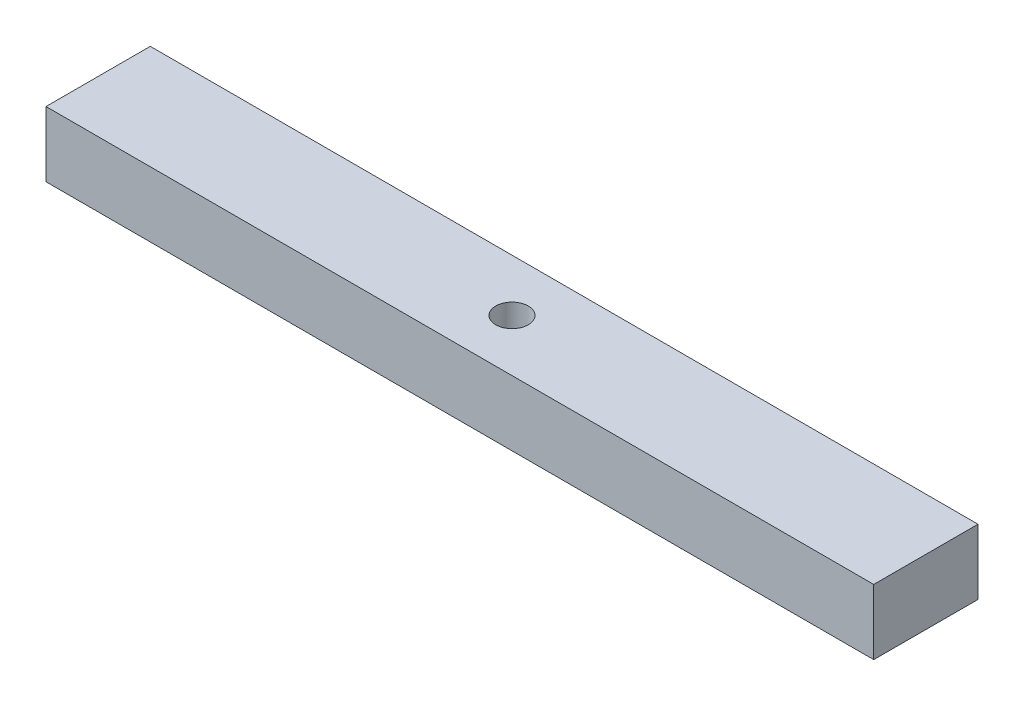
ISO-10303-21;
HEADER;
FILE_DESCRIPTION(('STEP AP214'),'2;1');
FILE_NAME('part.step','',(''),(''),'','','');
FILE_SCHEMA(('AUTOMOTIVE_DESIGN { 1 0 10303 214 1 1 1 1 }'));
ENDSEC;
DATA;
#1=APPLICATION_CONTEXT('core data for automotive mechanical design processes');
#2=APPLICATION_PROTOCOL_DEFINITION('international standard','automotive_design',2000,#1);
#3=PRODUCT_CONTEXT('',#1,'mechanical');
#4=PRODUCT('Part','Part','',(#3));
#5=PRODUCT_RELATED_PRODUCT_CATEGORY('part','',(#4));
#6=PRODUCT_DEFINITION_FORMATION('','',#4);
#7=PRODUCT_DEFINITION_CONTEXT('part definition',#1,'design');
#8=PRODUCT_DEFINITION('design','',#6,#7);
#9=PRODUCT_DEFINITION_SHAPE('','',#8);
#10=(LENGTH_UNIT() NAMED_UNIT(*) SI_UNIT(.MILLI.,.METRE.));
#11=(NAMED_UNIT(*) PLANE_ANGLE_UNIT() SI_UNIT($,.RADIAN.));
#12=(NAMED_UNIT(*) SI_UNIT($,.STERADIAN.) SOLID_ANGLE_UNIT());
#13=UNCERTAINTY_MEASURE_WITH_UNIT(LENGTH_MEASURE(1.E-05),#10,'distance_accuracy_value','');
#14=(GEOMETRIC_REPRESENTATION_CONTEXT(3) GLOBAL_UNCERTAINTY_ASSIGNED_CONTEXT((#13)) GLOBAL_UNIT_ASSIGNED_CONTEXT((#10,
#11,#12)) REPRESENTATION_CONTEXT('',''));
#15=CARTESIAN_POINT('',(0.,0.,0.));
#16=DIRECTION('',(0.,0.,1.));
#17=DIRECTION('',(1.,0.,0.));
#18=AXIS2_PLACEMENT_3D('',#15,#16,#17);
#19=CARTESIAN_POINT('',(0.,10.,0.));
#20=DIRECTION('',(0.,1.,0.));
#21=DIRECTION('',(0.,0.,1.));
#22=AXIS2_PLACEMENT_3D('',#19,#20,#21);
#23=PLANE('',#22);
#24=DIRECTION('',(0.,0.,1.));
#25=VECTOR('',#24,1.);
#26=CARTESIAN_POINT('',(-63.5,10.,8.));
#27=LINE('',#26,#25);
#28=CARTESIAN_POINT('',(-63.5,10.,-8.));
#29=VERTEX_POINT('',#28);
#30=CARTESIAN_POINT('',(-63.5,10.,8.));
#31=VERTEX_POINT('',#30);
#32=EDGE_CURVE('E85',#29,#31,#27,.T.);
#33=ORIENTED_EDGE('',*,*,#32,.T.);
#34=DIRECTION('',(1.,0.,0.));
#35=VECTOR('',#34,1.);
#36=CARTESIAN_POINT('',(63.5,10.,8.));
#37=LINE('',#36,#35);
#38=CARTESIAN_POINT('',(63.5,10.,8.));
#39=VERTEX_POINT('',#38);
#40=EDGE_CURVE('E80',#31,#39,#37,.T.);
#41=ORIENTED_EDGE('',*,*,#40,.T.);
#42=DIRECTION('',(0.,0.,-1.));
#43=VECTOR('',#42,1.);
#44=CARTESIAN_POINT('',(63.5,10.,8.));
#45=LINE('',#44,#43);
#46=CARTESIAN_POINT('',(63.5,10.,-8.));
#47=VERTEX_POINT('',#46);
#48=EDGE_CURVE('E83',#39,#47,#45,.T.);
#49=ORIENTED_EDGE('',*,*,#48,.T.);
#50=DIRECTION('',(-1.,0.,0.));
#51=VECTOR('',#50,1.);
#52=CARTESIAN_POINT('',(63.5,10.,-8.));
#53=LINE('',#52,#51);
#54=EDGE_CURVE('E50',#47,#29,#53,.T.);
#55=ORIENTED_EDGE('',*,*,#54,.T.);
#56=EDGE_LOOP('',(#33,#41,#49,#55));
#57=FACE_BOUND('',#56,.T.);
#58=CARTESIAN_POINT('',(0.,10.,0.));
#59=DIRECTION('',(0.,1.,0.));
#60=DIRECTION('',(0.,0.,1.));
#61=AXIS2_PLACEMENT_3D('',#58,#59,#60);
#62=CIRCLE('',#61,2.5);
#63=CARTESIAN_POINT('',(0.,10.,2.5));
#64=VERTEX_POINT('',#63);
#65=EDGE_CURVE('E100',#64,#64,#62,.T.);
#66=ORIENTED_EDGE('',*,*,#65,.F.);
#67=EDGE_LOOP('',(#66));
#68=FACE_BOUND('',#67,.T.);
#69=ADVANCED_FACE('F33',(#57,#68),#23,.T.);
#70=CARTESIAN_POINT('',(0.,0.,0.));
#71=DIRECTION('',(0.,1.,0.));
#72=DIRECTION('',(0.,0.,1.));
#73=AXIS2_PLACEMENT_3D('',#70,#71,#72);
#74=PLANE('',#73);
#75=DIRECTION('',(0.,0.,1.));
#76=VECTOR('',#75,1.);
#77=CARTESIAN_POINT('',(-63.5,0.,8.));
#78=LINE('',#77,#76);
#79=CARTESIAN_POINT('',(-63.5,0.,-8.));
#80=VERTEX_POINT('',#79);
#81=CARTESIAN_POINT('',(-63.5,0.,8.));
#82=VERTEX_POINT('',#81);
#83=EDGE_CURVE('E97',#80,#82,#78,.T.);
#84=ORIENTED_EDGE('',*,*,#83,.F.);
#85=DIRECTION('',(-1.,0.,0.));
#86=VECTOR('',#85,1.);
#87=CARTESIAN_POINT('',(63.5,0.,-8.));
#88=LINE('',#87,#86);
#89=CARTESIAN_POINT('',(63.5,0.,-8.));
#90=VERTEX_POINT('',#89);
#91=EDGE_CURVE('E73',#90,#80,#88,.T.);
#92=ORIENTED_EDGE('',*,*,#91,.F.);
#93=DIRECTION('',(0.,0.,-1.));
#94=VECTOR('',#93,1.);
#95=CARTESIAN_POINT('',(63.5,0.,8.));
#96=LINE('',#95,#94);
#97=CARTESIAN_POINT('',(63.5,0.,8.));
#98=VERTEX_POINT('',#97);
#99=EDGE_CURVE('E67',#98,#90,#96,.T.);
#100=ORIENTED_EDGE('',*,*,#99,.F.);
#101=DIRECTION('',(1.,0.,0.));
#102=VECTOR('',#101,1.);
#103=CARTESIAN_POINT('',(63.5,0.,8.));
#104=LINE('',#103,#102);
#105=EDGE_CURVE('E89',#82,#98,#104,.T.);
#106=ORIENTED_EDGE('',*,*,#105,.F.);
#107=EDGE_LOOP('',(#84,#92,#100,#106));
#108=FACE_BOUND('',#107,.T.);
#109=CARTESIAN_POINT('',(0.,0.,0.));
#110=DIRECTION('',(0.,1.,0.));
#111=DIRECTION('',(0.,0.,1.));
#112=AXIS2_PLACEMENT_3D('',#109,#110,#111);
#113=CIRCLE('',#112,2.5);
#114=CARTESIAN_POINT('',(0.,0.,2.5));
#115=VERTEX_POINT('',#114);
#116=EDGE_CURVE('E112',#115,#115,#113,.T.);
#117=ORIENTED_EDGE('',*,*,#116,.T.);
#118=EDGE_LOOP('',(#117));
#119=FACE_BOUND('',#118,.T.);
#120=ADVANCED_FACE('F108',(#108,#119),#74,.F.);
#121=CARTESIAN_POINT('',(-63.5,10.,8.));
#122=DIRECTION('',(1.,0.,0.));
#123=DIRECTION('',(0.,0.,-1.));
#124=AXIS2_PLACEMENT_3D('',#121,#122,#123);
#125=PLANE('',#124);
#126=ORIENTED_EDGE('',*,*,#83,.T.);
#127=DIRECTION('',(0.,-1.,0.));
#128=VECTOR('',#127,1.);
#129=CARTESIAN_POINT('',(-63.5,10.,8.));
#130=LINE('',#129,#128);
#131=EDGE_CURVE('E11',#31,#82,#130,.T.);
#132=ORIENTED_EDGE('',*,*,#131,.F.);
#133=ORIENTED_EDGE('',*,*,#32,.F.);
#134=DIRECTION('',(0.,-1.,0.));
#135=VECTOR('',#134,1.);
#136=CARTESIAN_POINT('',(-63.5,10.,-8.));
#137=LINE('',#136,#135);
#138=EDGE_CURVE('E93',#29,#80,#137,.T.);
#139=ORIENTED_EDGE('',*,*,#138,.T.);
#140=EDGE_LOOP('',(#126,#132,#133,#139));
#141=FACE_BOUND('',#140,.T.);
#142=ADVANCED_FACE('F35',(#141),#125,.F.);
#143=CARTESIAN_POINT('',(63.5,10.,8.));
#144=DIRECTION('',(0.,0.,-1.));
#145=DIRECTION('',(-1.,0.,0.));
#146=AXIS2_PLACEMENT_3D('',#143,#144,#145);
#147=PLANE('',#146);
#148=ORIENTED_EDGE('',*,*,#105,.T.);
#149=DIRECTION('',(0.,-1.,0.));
#150=VECTOR('',#149,1.);
#151=CARTESIAN_POINT('',(63.5,10.,8.));
#152=LINE('',#151,#150);
#153=EDGE_CURVE('E42',#39,#98,#152,.T.);
#154=ORIENTED_EDGE('',*,*,#153,.F.);
#155=ORIENTED_EDGE('',*,*,#40,.F.);
#156=ORIENTED_EDGE('',*,*,#131,.T.);
#157=EDGE_LOOP('',(#148,#154,#155,#156));
#158=FACE_BOUND('',#157,.T.);
#159=ADVANCED_FACE('F88',(#158),#147,.F.);
#160=CARTESIAN_POINT('',(63.5,10.,8.));
#161=DIRECTION('',(-1.,0.,0.));
#162=DIRECTION('',(0.,0.,1.));
#163=AXIS2_PLACEMENT_3D('',#160,#161,#162);
#164=PLANE('',#163);
#165=ORIENTED_EDGE('',*,*,#99,.T.);
#166=DIRECTION('',(0.,-1.,0.));
#167=VECTOR('',#166,1.);
#168=CARTESIAN_POINT('',(63.5,10.,-8.));
#169=LINE('',#168,#167);
#170=EDGE_CURVE('E90',#47,#90,#169,.T.);
#171=ORIENTED_EDGE('',*,*,#170,.F.);
#172=ORIENTED_EDGE('',*,*,#48,.F.);
#173=ORIENTED_EDGE('',*,*,#153,.T.);
#174=EDGE_LOOP('',(#165,#171,#172,#173));
#175=FACE_BOUND('',#174,.T.);
#176=ADVANCED_FACE('F91',(#175),#164,.F.);
#177=CARTESIAN_POINT('',(63.5,10.,-8.));
#178=DIRECTION('',(0.,0.,1.));
#179=DIRECTION('',(1.,0.,0.));
#180=AXIS2_PLACEMENT_3D('',#177,#178,#179);
#181=PLANE('',#180);
#182=ORIENTED_EDGE('',*,*,#91,.T.);
#183=ORIENTED_EDGE('',*,*,#138,.F.);
#184=ORIENTED_EDGE('',*,*,#54,.F.);
#185=ORIENTED_EDGE('',*,*,#170,.T.);
#186=EDGE_LOOP('',(#182,#183,#184,#185));
#187=FACE_BOUND('',#186,.T.);
#188=ADVANCED_FACE('F105',(#187),#181,.F.);
#189=CARTESIAN_POINT('',(0.,10.,0.));
#190=DIRECTION('',(0.,-1.,0.));
#191=DIRECTION('',(0.,0.,-1.));
#192=AXIS2_PLACEMENT_3D('',#189,#190,#191);
#193=CYLINDRICAL_SURFACE('',#192,2.5);
#194=ORIENTED_EDGE('',*,*,#65,.T.);
#195=EDGE_LOOP('',(#194));
#196=FACE_BOUND('',#195,.T.);
#197=ORIENTED_EDGE('',*,*,#116,.F.);
#198=EDGE_LOOP('',(#197));
#199=FACE_BOUND('',#198,.T.);
#200=ADVANCED_FACE('F118',(#196,#199),#193,.F.);
#201=CLOSED_SHELL('',(#69,#120,#142,#159,#176,#188,#200));
#202=MANIFOLD_SOLID_BREP('B2',#201);
#203=ADVANCED_BREP_SHAPE_REPRESENTATION('',(#18,#202),#14);
#204=SHAPE_DEFINITION_REPRESENTATION(#9,#203);
ENDSEC;
END-ISO-10303-21;
